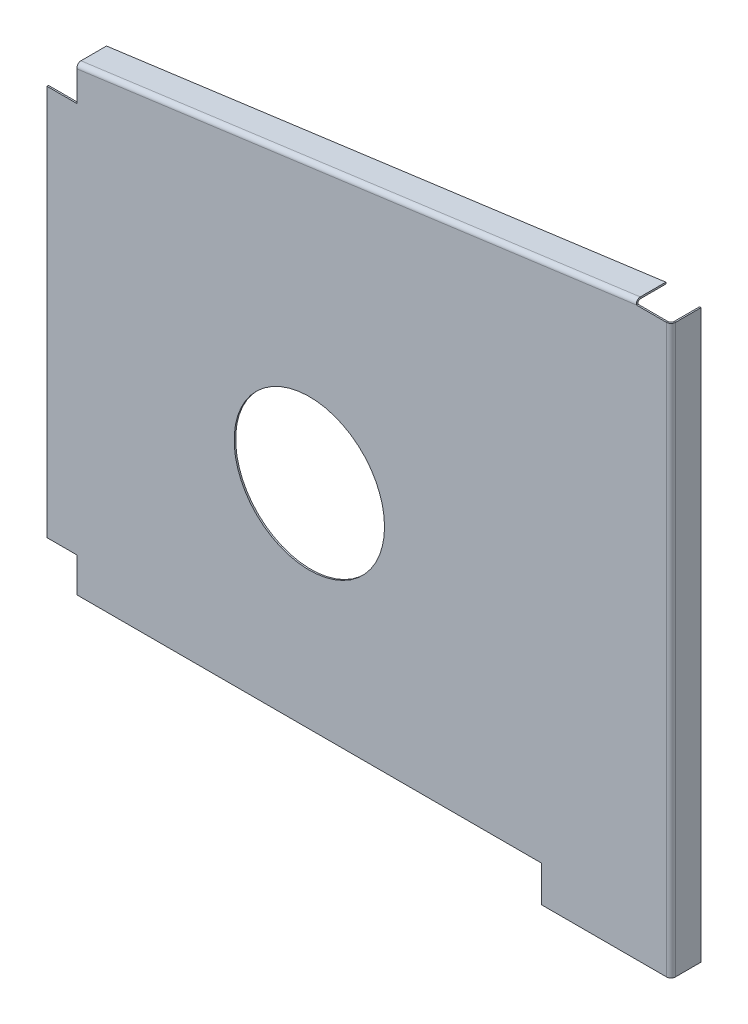
ISO-10303-21;
HEADER;
FILE_DESCRIPTION(('STEP AP214'),'2;1');
FILE_NAME('part.step','',(''),(''),'','','');
FILE_SCHEMA(('AUTOMOTIVE_DESIGN { 1 0 10303 214 1 1 1 1 }'));
ENDSEC;
DATA;
#1=APPLICATION_CONTEXT('core data for automotive mechanical design processes');
#2=APPLICATION_PROTOCOL_DEFINITION('international standard','automotive_design',2000,#1);
#3=PRODUCT_CONTEXT('',#1,'mechanical');
#4=PRODUCT('Part','Part','',(#3));
#5=PRODUCT_RELATED_PRODUCT_CATEGORY('part','',(#4));
#6=PRODUCT_DEFINITION_FORMATION('','',#4);
#7=PRODUCT_DEFINITION_CONTEXT('part definition',#1,'design');
#8=PRODUCT_DEFINITION('design','',#6,#7);
#9=PRODUCT_DEFINITION_SHAPE('','',#8);
#10=(LENGTH_UNIT() NAMED_UNIT(*) SI_UNIT(.MILLI.,.METRE.));
#11=(NAMED_UNIT(*) PLANE_ANGLE_UNIT() SI_UNIT($,.RADIAN.));
#12=(NAMED_UNIT(*) SI_UNIT($,.STERADIAN.) SOLID_ANGLE_UNIT());
#13=UNCERTAINTY_MEASURE_WITH_UNIT(LENGTH_MEASURE(1.E-05),#10,'distance_accuracy_value','');
#14=(GEOMETRIC_REPRESENTATION_CONTEXT(3) GLOBAL_UNCERTAINTY_ASSIGNED_CONTEXT((#13)) GLOBAL_UNIT_ASSIGNED_CONTEXT((#10,
#11,#12)) REPRESENTATION_CONTEXT('',''));
#15=CARTESIAN_POINT('',(0.,0.,0.));
#16=DIRECTION('',(0.,0.,1.));
#17=DIRECTION('',(1.,0.,0.));
#18=AXIS2_PLACEMENT_3D('',#15,#16,#17);
#19=CARTESIAN_POINT('',(-174.5,-118.5,1.));
#20=DIRECTION('',(0.,-1.,0.));
#21=DIRECTION('',(1.,0.,0.));
#22=AXIS2_PLACEMENT_3D('',#19,#20,#21);
#23=PLANE('',#22);
#24=DIRECTION('',(0.,0.,1.));
#25=VECTOR('',#24,1.);
#26=CARTESIAN_POINT('',(-174.5,-118.5,1.));
#27=LINE('',#26,#25);
#28=CARTESIAN_POINT('',(-174.5,-118.5,1.));
#29=VERTEX_POINT('',#28);
#30=CARTESIAN_POINT('',(-174.5,-118.5,2.));
#31=VERTEX_POINT('',#30);
#32=EDGE_CURVE('E13',#29,#31,#27,.T.);
#33=ORIENTED_EDGE('',*,*,#32,.F.);
#34=DIRECTION('',(1.,0.,0.));
#35=VECTOR('',#34,1.);
#36=CARTESIAN_POINT('',(-174.5,-118.5,1.));
#37=LINE('',#36,#35);
#38=CARTESIAN_POINT('',(-154.5,-118.5,1.));
#39=VERTEX_POINT('',#38);
#40=EDGE_CURVE('E203',#29,#39,#37,.T.);
#41=ORIENTED_EDGE('',*,*,#40,.T.);
#42=DIRECTION('',(0.,0.,1.));
#43=VECTOR('',#42,1.);
#44=CARTESIAN_POINT('',(-154.5,-118.5,1.));
#45=LINE('',#44,#43);
#46=CARTESIAN_POINT('',(-154.5,-118.5,2.));
#47=VERTEX_POINT('',#46);
#48=EDGE_CURVE('E89',#39,#47,#45,.T.);
#49=ORIENTED_EDGE('',*,*,#48,.T.);
#50=DIRECTION('',(1.,0.,0.));
#51=VECTOR('',#50,1.);
#52=CARTESIAN_POINT('',(0.,-118.5,2.));
#53=LINE('',#52,#51);
#54=EDGE_CURVE('E202',#31,#47,#53,.T.);
#55=ORIENTED_EDGE('',*,*,#54,.F.);
#56=EDGE_LOOP('',(#33,#41,#49,#55));
#57=FACE_BOUND('',#56,.T.);
#58=ADVANCED_FACE('F79',(#57),#23,.T.);
#59=CARTESIAN_POINT('',(-154.5,-118.5,1.));
#60=DIRECTION('',(-1.,0.,0.));
#61=DIRECTION('',(0.,-1.,0.));
#62=AXIS2_PLACEMENT_3D('',#59,#60,#61);
#63=PLANE('',#62);
#64=ORIENTED_EDGE('',*,*,#48,.F.);
#65=DIRECTION('',(0.,-1.,0.));
#66=VECTOR('',#65,1.);
#67=CARTESIAN_POINT('',(-154.5,-118.5,1.));
#68=LINE('',#67,#66);
#69=CARTESIAN_POINT('',(-154.5,-141.5,1.));
#70=VERTEX_POINT('',#69);
#71=EDGE_CURVE('E233',#39,#70,#68,.T.);
#72=ORIENTED_EDGE('',*,*,#71,.T.);
#73=DIRECTION('',(0.,0.,1.));
#74=VECTOR('',#73,1.);
#75=CARTESIAN_POINT('',(-154.5,-141.5,1.));
#76=LINE('',#75,#74);
#77=CARTESIAN_POINT('',(-154.5,-141.5,2.));
#78=VERTEX_POINT('',#77);
#79=EDGE_CURVE('E196',#70,#78,#76,.T.);
#80=ORIENTED_EDGE('',*,*,#79,.T.);
#81=DIRECTION('',(0.,1.,0.));
#82=VECTOR('',#81,1.);
#83=CARTESIAN_POINT('',(-154.5,0.,2.));
#84=LINE('',#83,#82);
#85=EDGE_CURVE('E214',#47,#78,#84,.F.);
#86=ORIENTED_EDGE('',*,*,#85,.F.);
#87=EDGE_LOOP('',(#64,#72,#80,#86));
#88=FACE_BOUND('',#87,.T.);
#89=ADVANCED_FACE('F219',(#88),#63,.T.);
#90=CARTESIAN_POINT('',(-154.5,-141.5,1.));
#91=DIRECTION('',(0.,-1.,0.));
#92=DIRECTION('',(1.,0.,0.));
#93=AXIS2_PLACEMENT_3D('',#90,#91,#92);
#94=PLANE('',#93);
#95=ORIENTED_EDGE('',*,*,#79,.F.);
#96=DIRECTION('',(1.,0.,0.));
#97=VECTOR('',#96,1.);
#98=CARTESIAN_POINT('',(-154.5,-141.5,1.));
#99=LINE('',#98,#97);
#100=CARTESIAN_POINT('',(154.5,-141.5,1.));
#101=VERTEX_POINT('',#100);
#102=EDGE_CURVE('E235',#70,#101,#99,.T.);
#103=ORIENTED_EDGE('',*,*,#102,.T.);
#104=DIRECTION('',(0.,0.,1.));
#105=VECTOR('',#104,1.);
#106=CARTESIAN_POINT('',(154.5,-141.5,1.));
#107=LINE('',#106,#105);
#108=CARTESIAN_POINT('',(154.5,-141.5,2.));
#109=VERTEX_POINT('',#108);
#110=EDGE_CURVE('E194',#101,#109,#107,.T.);
#111=ORIENTED_EDGE('',*,*,#110,.T.);
#112=DIRECTION('',(1.,0.,0.));
#113=VECTOR('',#112,1.);
#114=CARTESIAN_POINT('',(0.,-141.5,2.));
#115=LINE('',#114,#113);
#116=EDGE_CURVE('E220',#78,#109,#115,.T.);
#117=ORIENTED_EDGE('',*,*,#116,.F.);
#118=EDGE_LOOP('',(#95,#103,#111,#117));
#119=FACE_BOUND('',#118,.T.);
#120=ADVANCED_FACE('F463',(#119),#94,.T.);
#121=CARTESIAN_POINT('',(154.5,-141.5,1.));
#122=DIRECTION('',(-1.,0.,0.));
#123=DIRECTION('',(0.,-1.,0.));
#124=AXIS2_PLACEMENT_3D('',#121,#122,#123);
#125=PLANE('',#124);
#126=ORIENTED_EDGE('',*,*,#110,.F.);
#127=DIRECTION('',(0.,-1.,0.));
#128=VECTOR('',#127,1.);
#129=CARTESIAN_POINT('',(154.5,-141.5,1.));
#130=LINE('',#129,#128);
#131=CARTESIAN_POINT('',(154.5,-165.5,1.));
#132=VERTEX_POINT('',#131);
#133=EDGE_CURVE('E238',#101,#132,#130,.T.);
#134=ORIENTED_EDGE('',*,*,#133,.T.);
#135=DIRECTION('',(0.,0.,1.));
#136=VECTOR('',#135,1.);
#137=CARTESIAN_POINT('',(154.5,-165.5,1.));
#138=LINE('',#137,#136);
#139=CARTESIAN_POINT('',(154.5,-165.5,2.));
#140=VERTEX_POINT('',#139);
#141=EDGE_CURVE('E145',#132,#140,#138,.T.);
#142=ORIENTED_EDGE('',*,*,#141,.T.);
#143=DIRECTION('',(0.,1.,0.));
#144=VECTOR('',#143,1.);
#145=CARTESIAN_POINT('',(154.5,0.,2.));
#146=LINE('',#145,#144);
#147=EDGE_CURVE('E222',#109,#140,#146,.F.);
#148=ORIENTED_EDGE('',*,*,#147,.F.);
#149=EDGE_LOOP('',(#126,#134,#142,#148));
#150=FACE_BOUND('',#149,.T.);
#151=ADVANCED_FACE('F464',(#150),#125,.T.);
#152=CARTESIAN_POINT('',(154.5,-165.5,1.));
#153=DIRECTION('',(0.,-1.,0.));
#154=DIRECTION('',(1.,0.,0.));
#155=AXIS2_PLACEMENT_3D('',#152,#153,#154);
#156=PLANE('',#155);
#157=ORIENTED_EDGE('',*,*,#141,.F.);
#158=DIRECTION('',(1.,0.,0.));
#159=VECTOR('',#158,1.);
#160=CARTESIAN_POINT('',(154.5,-165.5,1.));
#161=LINE('',#160,#159);
#162=CARTESIAN_POINT('',(237.5,-165.5,1.00000000000005));
#163=VERTEX_POINT('',#162);
#164=EDGE_CURVE('E241',#132,#163,#161,.T.);
#165=ORIENTED_EDGE('',*,*,#164,.T.);
#166=DIRECTION('',(0.,0.,1.));
#167=VECTOR('',#166,1.);
#168=CARTESIAN_POINT('',(237.5,-165.5,1.));
#169=LINE('',#168,#167);
#170=CARTESIAN_POINT('',(237.5,-165.5,2.00000000000005));
#171=VERTEX_POINT('',#170);
#172=EDGE_CURVE('E190',#163,#171,#169,.T.);
#173=ORIENTED_EDGE('',*,*,#172,.T.);
#174=DIRECTION('',(1.,0.,0.));
#175=VECTOR('',#174,1.);
#176=CARTESIAN_POINT('',(0.,-165.5,2.));
#177=LINE('',#176,#175);
#178=EDGE_CURVE('E430',#140,#171,#177,.T.);
#179=ORIENTED_EDGE('',*,*,#178,.F.);
#180=EDGE_LOOP('',(#157,#165,#173,#179));
#181=FACE_BOUND('',#180,.T.);
#182=ADVANCED_FACE('F435',(#181),#156,.T.);
#183=CARTESIAN_POINT('',(237.5,211.5,1.));
#184=DIRECTION('',(0.,1.,0.));
#185=DIRECTION('',(-1.,0.,0.));
#186=AXIS2_PLACEMENT_3D('',#183,#184,#185);
#187=PLANE('',#186);
#188=DIRECTION('',(0.,0.,1.));
#189=VECTOR('',#188,1.);
#190=CARTESIAN_POINT('',(237.5,211.5,1.));
#191=LINE('',#190,#189);
#192=CARTESIAN_POINT('',(237.5,211.5,1.00000000000003));
#193=VERTEX_POINT('',#192);
#194=CARTESIAN_POINT('',(237.5,211.5,2.));
#195=VERTEX_POINT('',#194);
#196=EDGE_CURVE('E187',#193,#195,#191,.T.);
#197=ORIENTED_EDGE('',*,*,#196,.F.);
#198=DIRECTION('',(-1.,0.,0.));
#199=VECTOR('',#198,1.);
#200=CARTESIAN_POINT('',(237.5,211.5,1.));
#201=LINE('',#200,#199);
#202=CARTESIAN_POINT('',(217.5,211.5,0.999999999999373));
#203=VERTEX_POINT('',#202);
#204=EDGE_CURVE('E179',#193,#203,#201,.T.);
#205=ORIENTED_EDGE('',*,*,#204,.T.);
#206=DIRECTION('',(0.,0.,1.));
#207=VECTOR('',#206,1.);
#208=CARTESIAN_POINT('',(217.5,211.5,1.));
#209=LINE('',#208,#207);
#210=CARTESIAN_POINT('',(217.5,211.5,1.99999999999937));
#211=VERTEX_POINT('',#210);
#212=EDGE_CURVE('E184',#203,#211,#209,.T.);
#213=ORIENTED_EDGE('',*,*,#212,.T.);
#214=DIRECTION('',(1.,0.,0.));
#215=VECTOR('',#214,1.);
#216=CARTESIAN_POINT('',(0.,211.5,2.));
#217=LINE('',#216,#215);
#218=EDGE_CURVE('E425',#195,#211,#217,.F.);
#219=ORIENTED_EDGE('',*,*,#218,.F.);
#220=EDGE_LOOP('',(#197,#205,#213,#219));
#221=FACE_BOUND('',#220,.T.);
#222=ADVANCED_FACE('F250',(#221),#187,.T.);
#223=CARTESIAN_POINT('',(-154.5,161.5,1.));
#224=DIRECTION('',(-1.,0.,0.));
#225=DIRECTION('',(0.,-1.,0.));
#226=AXIS2_PLACEMENT_3D('',#223,#224,#225);
#227=PLANE('',#226);
#228=DIRECTION('',(0.,0.,1.));
#229=VECTOR('',#228,1.);
#230=CARTESIAN_POINT('',(-154.5,161.5,1.));
#231=LINE('',#230,#229);
#232=CARTESIAN_POINT('',(-154.5,161.500000000001,0.999999999999373));
#233=VERTEX_POINT('',#232);
#234=CARTESIAN_POINT('',(-154.5,161.5,2.));
#235=VERTEX_POINT('',#234);
#236=EDGE_CURVE('E155',#233,#235,#231,.T.);
#237=ORIENTED_EDGE('',*,*,#236,.F.);
#238=DIRECTION('',(0.,-1.,0.));
#239=VECTOR('',#238,1.);
#240=CARTESIAN_POINT('',(-154.5,161.5,1.));
#241=LINE('',#240,#239);
#242=CARTESIAN_POINT('',(-154.5,141.5,1.));
#243=VERTEX_POINT('',#242);
#244=EDGE_CURVE('E164',#233,#243,#241,.T.);
#245=ORIENTED_EDGE('',*,*,#244,.T.);
#246=DIRECTION('',(0.,0.,1.));
#247=VECTOR('',#246,1.);
#248=CARTESIAN_POINT('',(-154.5,141.5,1.));
#249=LINE('',#248,#247);
#250=CARTESIAN_POINT('',(-154.5,141.5,2.));
#251=VERTEX_POINT('',#250);
#252=EDGE_CURVE('E97',#243,#251,#249,.T.);
#253=ORIENTED_EDGE('',*,*,#252,.T.);
#254=DIRECTION('',(0.,1.,0.));
#255=VECTOR('',#254,1.);
#256=CARTESIAN_POINT('',(-154.5,0.,2.));
#257=LINE('',#256,#255);
#258=EDGE_CURVE('E229',#235,#251,#257,.F.);
#259=ORIENTED_EDGE('',*,*,#258,.F.);
#260=EDGE_LOOP('',(#237,#245,#253,#259));
#261=FACE_BOUND('',#260,.T.);
#262=ADVANCED_FACE('F171',(#261),#227,.T.);
#263=CARTESIAN_POINT('',(-154.5,141.5,1.));
#264=DIRECTION('',(0.,1.,0.));
#265=DIRECTION('',(-1.,0.,0.));
#266=AXIS2_PLACEMENT_3D('',#263,#264,#265);
#267=PLANE('',#266);
#268=ORIENTED_EDGE('',*,*,#252,.F.);
#269=DIRECTION('',(-1.,0.,0.));
#270=VECTOR('',#269,1.);
#271=CARTESIAN_POINT('',(-154.5,141.5,1.));
#272=LINE('',#271,#270);
#273=CARTESIAN_POINT('',(-174.5,141.5,1.));
#274=VERTEX_POINT('',#273);
#275=EDGE_CURVE('E151',#243,#274,#272,.T.);
#276=ORIENTED_EDGE('',*,*,#275,.T.);
#277=DIRECTION('',(0.,0.,1.));
#278=VECTOR('',#277,1.);
#279=CARTESIAN_POINT('',(-174.5,141.5,1.));
#280=LINE('',#279,#278);
#281=CARTESIAN_POINT('',(-174.5,141.5,2.));
#282=VERTEX_POINT('',#281);
#283=EDGE_CURVE('E83',#274,#282,#280,.T.);
#284=ORIENTED_EDGE('',*,*,#283,.T.);
#285=DIRECTION('',(1.,0.,0.));
#286=VECTOR('',#285,1.);
#287=CARTESIAN_POINT('',(0.,141.5,2.));
#288=LINE('',#287,#286);
#289=EDGE_CURVE('E153',#251,#282,#288,.F.);
#290=ORIENTED_EDGE('',*,*,#289,.F.);
#291=EDGE_LOOP('',(#268,#276,#284,#290));
#292=FACE_BOUND('',#291,.T.);
#293=ADVANCED_FACE('F150',(#292),#267,.T.);
#294=CARTESIAN_POINT('',(-174.5,141.5,1.));
#295=DIRECTION('',(-1.,0.,0.));
#296=DIRECTION('',(0.,-1.,0.));
#297=AXIS2_PLACEMENT_3D('',#294,#295,#296);
#298=PLANE('',#297);
#299=DIRECTION('',(0.,-1.,0.));
#300=VECTOR('',#299,1.);
#301=CARTESIAN_POINT('',(-174.5,141.5,1.));
#302=LINE('',#301,#300);
#303=EDGE_CURVE('E167',#274,#29,#302,.T.);
#304=ORIENTED_EDGE('',*,*,#303,.T.);
#305=ORIENTED_EDGE('',*,*,#32,.T.);
#306=DIRECTION('',(0.,1.,0.));
#307=VECTOR('',#306,1.);
#308=CARTESIAN_POINT('',(-174.5,0.,2.));
#309=LINE('',#308,#307);
#310=EDGE_CURVE('E217',#282,#31,#309,.F.);
#311=ORIENTED_EDGE('',*,*,#310,.F.);
#312=ORIENTED_EDGE('',*,*,#283,.F.);
#313=EDGE_LOOP('',(#304,#305,#311,#312));
#314=FACE_BOUND('',#313,.T.);
#315=ADVANCED_FACE('F459',(#314),#298,.T.);
#316=CARTESIAN_POINT('',(0.,0.,1.));
#317=DIRECTION('',(0.,0.,1.));
#318=DIRECTION('',(1.,0.,0.));
#319=AXIS2_PLACEMENT_3D('',#316,#317,#318);
#320=CYLINDRICAL_SURFACE('',#319,50.);
#321=CARTESIAN_POINT('',(0.,0.,2.));
#322=DIRECTION('',(0.,0.,1.));
#323=DIRECTION('',(1.,0.,0.));
#324=AXIS2_PLACEMENT_3D('',#321,#322,#323);
#325=CIRCLE('',#324,50.);
#326=CARTESIAN_POINT('',(50.,0.,2.));
#327=VERTEX_POINT('',#326);
#328=EDGE_CURVE('E227',#327,#327,#325,.T.);
#329=ORIENTED_EDGE('',*,*,#328,.T.);
#330=EDGE_LOOP('',(#329));
#331=FACE_BOUND('',#330,.T.);
#332=CARTESIAN_POINT('',(0.,0.,1.));
#333=DIRECTION('',(0.,0.,1.));
#334=DIRECTION('',(1.,0.,0.));
#335=AXIS2_PLACEMENT_3D('',#332,#333,#334);
#336=CIRCLE('',#335,50.);
#337=CARTESIAN_POINT('',(50.,0.,1.));
#338=VERTEX_POINT('',#337);
#339=EDGE_CURVE('E173',#338,#338,#336,.T.);
#340=ORIENTED_EDGE('',*,*,#339,.F.);
#341=EDGE_LOOP('',(#340));
#342=FACE_BOUND('',#341,.T.);
#343=ADVANCED_FACE('F81',(#331,#342),#320,.F.);
#344=CARTESIAN_POINT('',(0.,0.,2.));
#345=DIRECTION('',(0.,0.,1.));
#346=DIRECTION('',(1.,0.,0.));
#347=AXIS2_PLACEMENT_3D('',#344,#345,#346);
#348=PLANE('',#347);
#349=ORIENTED_EDGE('',*,*,#289,.T.);
#350=ORIENTED_EDGE('',*,*,#310,.T.);
#351=ORIENTED_EDGE('',*,*,#54,.T.);
#352=ORIENTED_EDGE('',*,*,#85,.T.);
#353=ORIENTED_EDGE('',*,*,#116,.T.);
#354=ORIENTED_EDGE('',*,*,#147,.T.);
#355=ORIENTED_EDGE('',*,*,#178,.T.);
#356=DIRECTION('',(0.,1.,0.));
#357=VECTOR('',#356,1.);
#358=CARTESIAN_POINT('',(237.5,0.,2.));
#359=LINE('',#358,#357);
#360=EDGE_CURVE('E427',#171,#195,#359,.T.);
#361=ORIENTED_EDGE('',*,*,#360,.T.);
#362=ORIENTED_EDGE('',*,*,#218,.T.);
#363=DIRECTION('',(-0.991087738166671,-0.13321071749552,0.));
#364=VECTOR('',#363,1.);
#365=CARTESIAN_POINT('',(217.5,211.5,2.));
#366=LINE('',#365,#364);
#367=EDGE_CURVE('E312',#211,#235,#366,.T.);
#368=ORIENTED_EDGE('',*,*,#367,.T.);
#369=ORIENTED_EDGE('',*,*,#258,.T.);
#370=EDGE_LOOP('',(#349,#350,#351,#352,#353,#354,#355,#361,#362,#368,#369));
#371=FACE_BOUND('',#370,.T.);
#372=ORIENTED_EDGE('',*,*,#328,.F.);
#373=EDGE_LOOP('',(#372));
#374=FACE_BOUND('',#373,.T.);
#375=ADVANCED_FACE('F211',(#371,#374),#348,.T.);
#376=CARTESIAN_POINT('',(0.,0.,1.));
#377=DIRECTION('',(0.,0.,1.));
#378=DIRECTION('',(1.,0.,0.));
#379=AXIS2_PLACEMENT_3D('',#376,#377,#378);
#380=PLANE('',#379);
#381=ORIENTED_EDGE('',*,*,#275,.F.);
#382=ORIENTED_EDGE('',*,*,#244,.F.);
#383=DIRECTION('',(-0.991087738166671,-0.13321071749552,0.));
#384=VECTOR('',#383,1.);
#385=CARTESIAN_POINT('',(217.5,211.5,1.));
#386=LINE('',#385,#384);
#387=EDGE_CURVE('E174',#203,#233,#386,.T.);
#388=ORIENTED_EDGE('',*,*,#387,.F.);
#389=ORIENTED_EDGE('',*,*,#204,.F.);
#390=DIRECTION('',(0.,1.,0.));
#391=VECTOR('',#390,1.);
#392=CARTESIAN_POINT('',(237.5,-165.5,1.));
#393=LINE('',#392,#391);
#394=EDGE_CURVE('E243',#163,#193,#393,.T.);
#395=ORIENTED_EDGE('',*,*,#394,.F.);
#396=ORIENTED_EDGE('',*,*,#164,.F.);
#397=ORIENTED_EDGE('',*,*,#133,.F.);
#398=ORIENTED_EDGE('',*,*,#102,.F.);
#399=ORIENTED_EDGE('',*,*,#71,.F.);
#400=ORIENTED_EDGE('',*,*,#40,.F.);
#401=ORIENTED_EDGE('',*,*,#303,.F.);
#402=EDGE_LOOP('',(#381,#382,#388,#389,#395,#396,#397,#398,#399,#400,#401));
#403=FACE_BOUND('',#402,.T.);
#404=ORIENTED_EDGE('',*,*,#339,.T.);
#405=EDGE_LOOP('',(#404));
#406=FACE_BOUND('',#405,.T.);
#407=ADVANCED_FACE('F160',(#403,#406),#380,.F.);
#408=CARTESIAN_POINT('',(237.5,211.5,-1.));
#409=DIRECTION('',(0.,1.,0.));
#410=DIRECTION('',(0.,0.,1.));
#411=AXIS2_PLACEMENT_3D('',#408,#409,#410);
#412=PLANE('',#411);
#413=DIRECTION('',(1.,0.,0.));
#414=VECTOR('',#413,1.);
#415=CARTESIAN_POINT('',(240.5,211.5,-0.999999999999997));
#416=LINE('',#415,#414);
#417=CARTESIAN_POINT('',(239.5,211.5,-0.999999999999997));
#418=VERTEX_POINT('',#417);
#419=CARTESIAN_POINT('',(240.5,211.5,-0.999999999999994));
#420=VERTEX_POINT('',#419);
#421=EDGE_CURVE('E277',#418,#420,#416,.T.);
#422=ORIENTED_EDGE('',*,*,#421,.F.);
#423=CARTESIAN_POINT('',(237.5,211.5,-1.));
#424=DIRECTION('',(0.,-1.,0.));
#425=DIRECTION('',(0.,0.,-1.));
#426=AXIS2_PLACEMENT_3D('',#423,#424,#425);
#427=CIRCLE('',#426,2.00000000000003);
#428=EDGE_CURVE('E419',#193,#418,#427,.F.);
#429=ORIENTED_EDGE('',*,*,#428,.F.);
#430=ORIENTED_EDGE('',*,*,#196,.T.);
#431=CARTESIAN_POINT('',(237.5,211.5,-1.));
#432=DIRECTION('',(0.,-1.,0.));
#433=DIRECTION('',(0.,0.,-1.));
#434=AXIS2_PLACEMENT_3D('',#431,#432,#433);
#435=CIRCLE('',#434,3.00000000000003);
#436=EDGE_CURVE('E168',#195,#420,#435,.F.);
#437=ORIENTED_EDGE('',*,*,#436,.T.);
#438=EDGE_LOOP('',(#422,#429,#430,#437));
#439=FACE_BOUND('',#438,.T.);
#440=ADVANCED_FACE('F457',(#439),#412,.T.);
#441=CARTESIAN_POINT('',(237.5,-165.5,-0.999999999999983));
#442=DIRECTION('',(0.,1.,0.));
#443=DIRECTION('',(0.,0.,1.));
#444=AXIS2_PLACEMENT_3D('',#441,#442,#443);
#445=PLANE('',#444);
#446=CARTESIAN_POINT('',(237.5,-165.5,-0.999999999999983));
#447=DIRECTION('',(0.,-1.,0.));
#448=DIRECTION('',(0.,0.,-1.));
#449=AXIS2_PLACEMENT_3D('',#446,#447,#448);
#450=CIRCLE('',#449,2.00000000000003);
#451=CARTESIAN_POINT('',(239.5,-165.5,-0.999999999999977));
#452=VERTEX_POINT('',#451);
#453=EDGE_CURVE('E392',#452,#163,#450,.T.);
#454=ORIENTED_EDGE('',*,*,#453,.F.);
#455=DIRECTION('',(1.,0.,0.));
#456=VECTOR('',#455,1.);
#457=CARTESIAN_POINT('',(239.5,-165.5,-0.999999999999973));
#458=LINE('',#457,#456);
#459=CARTESIAN_POINT('',(240.5,-165.5,-0.99999999999997));
#460=VERTEX_POINT('',#459);
#461=EDGE_CURVE('E412',#452,#460,#458,.T.);
#462=ORIENTED_EDGE('',*,*,#461,.T.);
#463=CARTESIAN_POINT('',(237.5,-165.5,-0.999999999999983));
#464=DIRECTION('',(0.,-1.,0.));
#465=DIRECTION('',(0.,0.,-1.));
#466=AXIS2_PLACEMENT_3D('',#463,#464,#465);
#467=CIRCLE('',#466,3.00000000000003);
#468=EDGE_CURVE('E285',#460,#171,#467,.T.);
#469=ORIENTED_EDGE('',*,*,#468,.T.);
#470=ORIENTED_EDGE('',*,*,#172,.F.);
#471=EDGE_LOOP('',(#454,#462,#469,#470));
#472=FACE_BOUND('',#471,.T.);
#473=ADVANCED_FACE('F438',(#472),#445,.F.);
#474=CARTESIAN_POINT('',(237.5,-165.5,-0.999999999999983));
#475=DIRECTION('',(0.,-1.,0.));
#476=DIRECTION('',(1.,0.,0.));
#477=AXIS2_PLACEMENT_3D('',#474,#475,#476);
#478=CYLINDRICAL_SURFACE('',#477,3.00000000000003);
#479=ORIENTED_EDGE('',*,*,#360,.F.);
#480=ORIENTED_EDGE('',*,*,#468,.F.);
#481=DIRECTION('',(0.,-1.,0.));
#482=VECTOR('',#481,1.);
#483=CARTESIAN_POINT('',(240.5,0.,-0.999999999999982));
#484=LINE('',#483,#482);
#485=EDGE_CURVE('E409',#420,#460,#484,.T.);
#486=ORIENTED_EDGE('',*,*,#485,.F.);
#487=ORIENTED_EDGE('',*,*,#436,.F.);
#488=EDGE_LOOP('',(#479,#480,#486,#487));
#489=FACE_BOUND('',#488,.T.);
#490=ADVANCED_FACE('F456',(#489),#478,.T.);
#491=CARTESIAN_POINT('',(237.5,-165.5,-0.999999999999983));
#492=DIRECTION('',(0.,-1.,0.));
#493=DIRECTION('',(1.,0.,0.));
#494=AXIS2_PLACEMENT_3D('',#491,#492,#493);
#495=CYLINDRICAL_SURFACE('',#494,2.00000000000003);
#496=ORIENTED_EDGE('',*,*,#394,.T.);
#497=ORIENTED_EDGE('',*,*,#428,.T.);
#498=DIRECTION('',(0.,1.,0.));
#499=VECTOR('',#498,1.);
#500=CARTESIAN_POINT('',(239.5,211.5,-1.));
#501=LINE('',#500,#499);
#502=EDGE_CURVE('E414',#418,#452,#501,.F.);
#503=ORIENTED_EDGE('',*,*,#502,.T.);
#504=ORIENTED_EDGE('',*,*,#453,.T.);
#505=EDGE_LOOP('',(#496,#497,#503,#504));
#506=FACE_BOUND('',#505,.T.);
#507=ADVANCED_FACE('F439',(#506),#495,.F.);
#508=CARTESIAN_POINT('',(240.5,-165.5,1.));
#509=DIRECTION('',(0.,-1.,0.));
#510=DIRECTION('',(0.,0.,-1.));
#511=AXIS2_PLACEMENT_3D('',#508,#509,#510);
#512=PLANE('',#511);
#513=DIRECTION('',(0.,0.,1.));
#514=VECTOR('',#513,1.);
#515=CARTESIAN_POINT('',(240.5,-165.5,1.));
#516=LINE('',#515,#514);
#517=CARTESIAN_POINT('',(240.5,-165.5,-18.));
#518=VERTEX_POINT('',#517);
#519=EDGE_CURVE('E395',#518,#460,#516,.T.);
#520=ORIENTED_EDGE('',*,*,#519,.T.);
#521=ORIENTED_EDGE('',*,*,#461,.F.);
#522=DIRECTION('',(0.,0.,-1.));
#523=VECTOR('',#522,1.);
#524=CARTESIAN_POINT('',(239.5,-165.5,9.35655062200543E-13));
#525=LINE('',#524,#523);
#526=CARTESIAN_POINT('',(239.5,-165.5,-18.));
#527=VERTEX_POINT('',#526);
#528=EDGE_CURVE('E403',#527,#452,#525,.F.);
#529=ORIENTED_EDGE('',*,*,#528,.F.);
#530=DIRECTION('',(-1.,0.,0.));
#531=VECTOR('',#530,1.);
#532=CARTESIAN_POINT('',(240.5,-165.5,-18.));
#533=LINE('',#532,#531);
#534=EDGE_CURVE('E390',#518,#527,#533,.T.);
#535=ORIENTED_EDGE('',*,*,#534,.F.);
#536=EDGE_LOOP('',(#520,#521,#529,#535));
#537=FACE_BOUND('',#536,.T.);
#538=ADVANCED_FACE('F452',(#537),#512,.T.);
#539=CARTESIAN_POINT('',(240.5,211.5,-18.));
#540=DIRECTION('',(0.,1.,0.));
#541=DIRECTION('',(0.,0.,1.));
#542=AXIS2_PLACEMENT_3D('',#539,#540,#541);
#543=PLANE('',#542);
#544=DIRECTION('',(0.,0.,1.));
#545=VECTOR('',#544,1.);
#546=CARTESIAN_POINT('',(239.5,211.5,0.));
#547=LINE('',#546,#545);
#548=CARTESIAN_POINT('',(239.5,211.5,-18.));
#549=VERTEX_POINT('',#548);
#550=EDGE_CURVE('E304',#418,#549,#547,.F.);
#551=ORIENTED_EDGE('',*,*,#550,.F.);
#552=ORIENTED_EDGE('',*,*,#421,.T.);
#553=DIRECTION('',(0.,0.,-1.));
#554=VECTOR('',#553,1.);
#555=CARTESIAN_POINT('',(240.5,211.5,-18.));
#556=LINE('',#555,#554);
#557=CARTESIAN_POINT('',(240.5,211.5,-18.));
#558=VERTEX_POINT('',#557);
#559=EDGE_CURVE('E401',#420,#558,#556,.T.);
#560=ORIENTED_EDGE('',*,*,#559,.T.);
#561=DIRECTION('',(-1.,0.,0.));
#562=VECTOR('',#561,1.);
#563=CARTESIAN_POINT('',(240.5,211.5,-18.));
#564=LINE('',#563,#562);
#565=EDGE_CURVE('E393',#558,#549,#564,.T.);
#566=ORIENTED_EDGE('',*,*,#565,.T.);
#567=EDGE_LOOP('',(#551,#552,#560,#566));
#568=FACE_BOUND('',#567,.T.);
#569=ADVANCED_FACE('F444',(#568),#543,.T.);
#570=CARTESIAN_POINT('',(240.5,0.,6.97380871729566E-13));
#571=DIRECTION('',(1.,0.,0.));
#572=DIRECTION('',(0.,0.,-1.));
#573=AXIS2_PLACEMENT_3D('',#570,#571,#572);
#574=PLANE('',#573);
#575=ORIENTED_EDGE('',*,*,#559,.F.);
#576=ORIENTED_EDGE('',*,*,#485,.T.);
#577=ORIENTED_EDGE('',*,*,#519,.F.);
#578=DIRECTION('',(0.,-1.,0.));
#579=VECTOR('',#578,1.);
#580=CARTESIAN_POINT('',(240.5,-165.5,-18.));
#581=LINE('',#580,#579);
#582=EDGE_CURVE('E398',#558,#518,#581,.T.);
#583=ORIENTED_EDGE('',*,*,#582,.F.);
#584=EDGE_LOOP('',(#575,#576,#577,#583));
#585=FACE_BOUND('',#584,.T.);
#586=ADVANCED_FACE('F455',(#585),#574,.T.);
#587=CARTESIAN_POINT('',(239.5,0.,6.93889390390723E-13));
#588=DIRECTION('',(1.,0.,0.));
#589=DIRECTION('',(0.,0.,-1.));
#590=AXIS2_PLACEMENT_3D('',#587,#588,#589);
#591=PLANE('',#590);
#592=ORIENTED_EDGE('',*,*,#502,.F.);
#593=ORIENTED_EDGE('',*,*,#550,.T.);
#594=DIRECTION('',(0.,1.,0.));
#595=VECTOR('',#594,1.);
#596=CARTESIAN_POINT('',(239.5,0.,-18.));
#597=LINE('',#596,#595);
#598=EDGE_CURVE('E406',#549,#527,#597,.F.);
#599=ORIENTED_EDGE('',*,*,#598,.T.);
#600=ORIENTED_EDGE('',*,*,#528,.T.);
#601=EDGE_LOOP('',(#592,#593,#599,#600));
#602=FACE_BOUND('',#601,.T.);
#603=ADVANCED_FACE('F440',(#602),#591,.F.);
#604=CARTESIAN_POINT('',(240.5,-165.5,-18.));
#605=DIRECTION('',(0.,0.,-1.));
#606=DIRECTION('',(-1.,0.,0.));
#607=AXIS2_PLACEMENT_3D('',#604,#605,#606);
#608=PLANE('',#607);
#609=ORIENTED_EDGE('',*,*,#598,.F.);
#610=ORIENTED_EDGE('',*,*,#565,.F.);
#611=ORIENTED_EDGE('',*,*,#582,.T.);
#612=ORIENTED_EDGE('',*,*,#534,.T.);
#613=EDGE_LOOP('',(#609,#610,#611,#612));
#614=FACE_BOUND('',#613,.T.);
#615=ADVANCED_FACE('F450',(#614),#608,.T.);
#616=CARTESIAN_POINT('',(-154.5,161.500000000001,-1.00000000000001));
#617=DIRECTION('',(-0.991087738166672,-0.133210717495517,0.));
#618=DIRECTION('',(0.133210717495517,-0.991087738166672,0.));
#619=AXIS2_PLACEMENT_3D('',#616,#617,#618);
#620=PLANE('',#619);
#621=DIRECTION('',(0.13321071749552,-0.991087738166672,0.));
#622=VECTOR('',#621,1.);
#623=CARTESIAN_POINT('',(-154.899632152487,164.4732632145,-0.999999999999998));
#624=LINE('',#623,#622);
#625=CARTESIAN_POINT('',(-154.766421434991,163.482175476333,-1.));
#626=VERTEX_POINT('',#625);
#627=CARTESIAN_POINT('',(-154.899632152487,164.4732632145,-0.999999999999998));
#628=VERTEX_POINT('',#627);
#629=EDGE_CURVE('E325',#626,#628,#624,.F.);
#630=ORIENTED_EDGE('',*,*,#629,.F.);
#631=CARTESIAN_POINT('',(-154.5,161.500000000001,-1.00000000000001));
#632=DIRECTION('',(0.991087738166672,0.133210717495517,0.));
#633=DIRECTION('',(-0.133210717495517,0.991087738166672,0.));
#634=AXIS2_PLACEMENT_3D('',#631,#632,#633);
#635=CIRCLE('',#634,1.99999999999938);
#636=EDGE_CURVE('E352',#233,#626,#635,.F.);
#637=ORIENTED_EDGE('',*,*,#636,.F.);
#638=ORIENTED_EDGE('',*,*,#236,.T.);
#639=CARTESIAN_POINT('',(-154.5,161.500000000001,-1.00000000000001));
#640=DIRECTION('',(0.991087738166672,0.133210717495517,0.));
#641=DIRECTION('',(-0.133210717495517,0.991087738166672,0.));
#642=AXIS2_PLACEMENT_3D('',#639,#640,#641);
#643=CIRCLE('',#642,2.99999999999938);
#644=EDGE_CURVE('E351',#235,#628,#643,.F.);
#645=ORIENTED_EDGE('',*,*,#644,.T.);
#646=EDGE_LOOP('',(#630,#637,#638,#645));
#647=FACE_BOUND('',#646,.T.);
#648=ADVANCED_FACE('F529',(#647),#620,.T.);
#649=CARTESIAN_POINT('',(217.5,211.499999999999,-1.00000000000001));
#650=DIRECTION('',(-0.991087738166672,-0.133210717495517,0.));
#651=DIRECTION('',(0.133210717495517,-0.991087738166672,0.));
#652=AXIS2_PLACEMENT_3D('',#649,#650,#651);
#653=PLANE('',#652);
#654=CARTESIAN_POINT('',(217.5,211.499999999999,-1.00000000000001));
#655=DIRECTION('',(0.991087738166672,0.133210717495517,0.));
#656=DIRECTION('',(-0.133210717495517,0.991087738166672,0.));
#657=AXIS2_PLACEMENT_3D('',#654,#655,#656);
#658=CIRCLE('',#657,1.99999999999938);
#659=CARTESIAN_POINT('',(217.233578565009,213.482175476332,-1.));
#660=VERTEX_POINT('',#659);
#661=EDGE_CURVE('E359',#660,#203,#658,.T.);
#662=ORIENTED_EDGE('',*,*,#661,.F.);
#663=DIRECTION('',(0.13321071749552,-0.991087738166672,0.));
#664=VECTOR('',#663,1.);
#665=CARTESIAN_POINT('',(217.233578565009,213.482175476333,-1.));
#666=LINE('',#665,#664);
#667=CARTESIAN_POINT('',(217.100367847513,214.4732632145,-0.999999999999998));
#668=VERTEX_POINT('',#667);
#669=EDGE_CURVE('E356',#660,#668,#666,.F.);
#670=ORIENTED_EDGE('',*,*,#669,.T.);
#671=CARTESIAN_POINT('',(217.5,211.499999999999,-1.00000000000001));
#672=DIRECTION('',(0.991087738166672,0.133210717495517,0.));
#673=DIRECTION('',(-0.133210717495517,0.991087738166672,0.));
#674=AXIS2_PLACEMENT_3D('',#671,#672,#673);
#675=CIRCLE('',#674,2.99999999999938);
#676=EDGE_CURVE('E345',#668,#211,#675,.T.);
#677=ORIENTED_EDGE('',*,*,#676,.T.);
#678=ORIENTED_EDGE('',*,*,#212,.F.);
#679=EDGE_LOOP('',(#662,#670,#677,#678));
#680=FACE_BOUND('',#679,.T.);
#681=ADVANCED_FACE('F357',(#680),#653,.F.);
#682=CARTESIAN_POINT('',(217.5,211.499999999999,-1.00000000000001));
#683=DIRECTION('',(0.991087738166672,0.133210717495517,0.));
#684=DIRECTION('',(-0.133210717495517,0.991087738166672,0.));
#685=AXIS2_PLACEMENT_3D('',#682,#683,#684);
#686=CYLINDRICAL_SURFACE('',#685,2.99999999999938);
#687=ORIENTED_EDGE('',*,*,#367,.F.);
#688=ORIENTED_EDGE('',*,*,#676,.F.);
#689=DIRECTION('',(0.991087738166671,0.13321071749552,0.));
#690=VECTOR('',#689,1.);
#691=CARTESIAN_POINT('',(-154.899632152487,164.4732632145,-0.999999999999998));
#692=LINE('',#691,#690);
#693=EDGE_CURVE('E349',#668,#628,#692,.F.);
#694=ORIENTED_EDGE('',*,*,#693,.T.);
#695=ORIENTED_EDGE('',*,*,#644,.F.);
#696=EDGE_LOOP('',(#687,#688,#694,#695));
#697=FACE_BOUND('',#696,.T.);
#698=ADVANCED_FACE('F347',(#697),#686,.T.);
#699=CARTESIAN_POINT('',(217.5,211.499999999999,-1.00000000000001));
#700=DIRECTION('',(0.991087738166672,0.133210717495517,0.));
#701=DIRECTION('',(-0.133210717495517,0.991087738166672,0.));
#702=AXIS2_PLACEMENT_3D('',#699,#700,#701);
#703=CYLINDRICAL_SURFACE('',#702,1.99999999999938);
#704=ORIENTED_EDGE('',*,*,#387,.T.);
#705=ORIENTED_EDGE('',*,*,#636,.T.);
#706=DIRECTION('',(0.991087738166671,0.13321071749552,0.));
#707=VECTOR('',#706,1.);
#708=CARTESIAN_POINT('',(-154.766421434991,163.482175476333,-1.));
#709=LINE('',#708,#707);
#710=EDGE_CURVE('E363',#626,#660,#709,.T.);
#711=ORIENTED_EDGE('',*,*,#710,.T.);
#712=ORIENTED_EDGE('',*,*,#661,.T.);
#713=EDGE_LOOP('',(#704,#705,#711,#712));
#714=FACE_BOUND('',#713,.T.);
#715=ADVANCED_FACE('F554',(#714),#703,.F.);
#716=CARTESIAN_POINT('',(217.100367847514,214.4732632145,-18.));
#717=DIRECTION('',(-0.991087738166671,-0.13321071749552,0.));
#718=DIRECTION('',(0.13321071749552,-0.991087738166672,0.));
#719=AXIS2_PLACEMENT_3D('',#716,#717,#718);
#720=PLANE('',#719);
#721=ORIENTED_EDGE('',*,*,#669,.F.);
#722=DIRECTION('',(0.,0.,1.));
#723=VECTOR('',#722,1.);
#724=CARTESIAN_POINT('',(217.233578565009,213.482175476333,-18.));
#725=LINE('',#724,#723);
#726=CARTESIAN_POINT('',(217.233578565009,213.482175476333,-18.));
#727=VERTEX_POINT('',#726);
#728=EDGE_CURVE('E369',#660,#727,#725,.F.);
#729=ORIENTED_EDGE('',*,*,#728,.T.);
#730=DIRECTION('',(0.13321071749552,-0.991087738166672,0.));
#731=VECTOR('',#730,1.);
#732=CARTESIAN_POINT('',(217.100367847514,214.4732632145,-18.));
#733=LINE('',#732,#731);
#734=CARTESIAN_POINT('',(217.100367847514,214.4732632145,-18.));
#735=VERTEX_POINT('',#734);
#736=EDGE_CURVE('E374',#735,#727,#733,.T.);
#737=ORIENTED_EDGE('',*,*,#736,.F.);
#738=DIRECTION('',(0.,0.,-1.));
#739=VECTOR('',#738,1.);
#740=CARTESIAN_POINT('',(217.100367847514,214.4732632145,6.21418243728897E-13));
#741=LINE('',#740,#739);
#742=EDGE_CURVE('E366',#668,#735,#741,.T.);
#743=ORIENTED_EDGE('',*,*,#742,.F.);
#744=EDGE_LOOP('',(#721,#729,#737,#743));
#745=FACE_BOUND('',#744,.T.);
#746=ADVANCED_FACE('F372',(#745),#720,.F.);
#747=CARTESIAN_POINT('',(-154.899632152487,164.4732632145,1.));
#748=DIRECTION('',(0.991087738166671,0.13321071749552,0.));
#749=DIRECTION('',(-0.13321071749552,0.991087738166672,0.));
#750=AXIS2_PLACEMENT_3D('',#747,#748,#749);
#751=PLANE('',#750);
#752=ORIENTED_EDGE('',*,*,#629,.T.);
#753=DIRECTION('',(0.,0.,1.));
#754=VECTOR('',#753,1.);
#755=CARTESIAN_POINT('',(-154.899632152487,164.4732632145,6.65880610452373E-13));
#756=LINE('',#755,#754);
#757=CARTESIAN_POINT('',(-154.899632152487,164.4732632145,-18.));
#758=VERTEX_POINT('',#757);
#759=EDGE_CURVE('E368',#758,#628,#756,.T.);
#760=ORIENTED_EDGE('',*,*,#759,.F.);
#761=DIRECTION('',(0.13321071749552,-0.991087738166672,0.));
#762=VECTOR('',#761,1.);
#763=CARTESIAN_POINT('',(-154.899632152487,164.4732632145,-18.));
#764=LINE('',#763,#762);
#765=CARTESIAN_POINT('',(-154.766421434991,163.482175476333,-18.));
#766=VERTEX_POINT('',#765);
#767=EDGE_CURVE('E805',#758,#766,#764,.T.);
#768=ORIENTED_EDGE('',*,*,#767,.T.);
#769=DIRECTION('',(0.,0.,-1.));
#770=VECTOR('',#769,1.);
#771=CARTESIAN_POINT('',(-154.766421434991,163.482175476333,1.));
#772=LINE('',#771,#770);
#773=EDGE_CURVE('E375',#766,#626,#772,.F.);
#774=ORIENTED_EDGE('',*,*,#773,.T.);
#775=EDGE_LOOP('',(#752,#760,#768,#774));
#776=FACE_BOUND('',#775,.T.);
#777=ADVANCED_FACE('F574',(#776),#751,.F.);
#778=CARTESIAN_POINT('',(-24.4630460248922,182.005062425198,5.2655786455933E-13));
#779=DIRECTION('',(0.13321071749552,-0.991087738166671,0.));
#780=DIRECTION('',(0.991087738166671,0.13321071749552,0.));
#781=AXIS2_PLACEMENT_3D('',#778,#779,#780);
#782=PLANE('',#781);
#783=ORIENTED_EDGE('',*,*,#693,.F.);
#784=ORIENTED_EDGE('',*,*,#742,.T.);
#785=DIRECTION('',(-0.991087738166671,-0.13321071749552,0.));
#786=VECTOR('',#785,1.);
#787=CARTESIAN_POINT('',(-24.4630460248922,182.005062425198,-18.));
#788=LINE('',#787,#786);
#789=EDGE_CURVE('E335',#735,#758,#788,.T.);
#790=ORIENTED_EDGE('',*,*,#789,.T.);
#791=ORIENTED_EDGE('',*,*,#759,.T.);
#792=EDGE_LOOP('',(#783,#784,#790,#791));
#793=FACE_BOUND('',#792,.T.);
#794=ADVANCED_FACE('F365',(#793),#782,.F.);
#795=CARTESIAN_POINT('',(-24.3298353073967,181.013974687031,5.23066383220487E-13));
#796=DIRECTION('',(0.13321071749552,-0.991087738166671,0.));
#797=DIRECTION('',(0.991087738166671,0.13321071749552,0.));
#798=AXIS2_PLACEMENT_3D('',#795,#796,#797);
#799=PLANE('',#798);
#800=ORIENTED_EDGE('',*,*,#728,.F.);
#801=ORIENTED_EDGE('',*,*,#710,.F.);
#802=ORIENTED_EDGE('',*,*,#773,.F.);
#803=DIRECTION('',(0.991087738166671,0.13321071749552,0.));
#804=VECTOR('',#803,1.);
#805=CARTESIAN_POINT('',(-154.766421434991,163.482175476333,-18.));
#806=LINE('',#805,#804);
#807=EDGE_CURVE('E379',#727,#766,#806,.F.);
#808=ORIENTED_EDGE('',*,*,#807,.F.);
#809=EDGE_LOOP('',(#800,#801,#802,#808));
#810=FACE_BOUND('',#809,.T.);
#811=ADVANCED_FACE('F594',(#810),#799,.T.);
#812=CARTESIAN_POINT('',(-154.899632152487,164.4732632145,-18.));
#813=DIRECTION('',(0.,0.,1.));
#814=DIRECTION('',(0.,-1.,0.));
#815=AXIS2_PLACEMENT_3D('',#812,#813,#814);
#816=PLANE('',#815);
#817=ORIENTED_EDGE('',*,*,#807,.T.);
#818=ORIENTED_EDGE('',*,*,#767,.F.);
#819=ORIENTED_EDGE('',*,*,#789,.F.);
#820=ORIENTED_EDGE('',*,*,#736,.T.);
#821=EDGE_LOOP('',(#817,#818,#819,#820));
#822=FACE_BOUND('',#821,.T.);
#823=ADVANCED_FACE('F604',(#822),#816,.F.);
#824=CLOSED_SHELL('',(#58,#89,#120,#151,#182,#222,#262,#293,#315,#343,#375,#407,#440,#473,#490,
#507,#538,#569,#586,#603,#615,#648,#681,#698,#715,#746,#777,#794,#811,#823));
#825=MANIFOLD_SOLID_BREP('B2',#824);
#826=ADVANCED_BREP_SHAPE_REPRESENTATION('',(#18,#825),#14);
#827=SHAPE_DEFINITION_REPRESENTATION(#9,#826);
ENDSEC;
END-ISO-10303-21;
